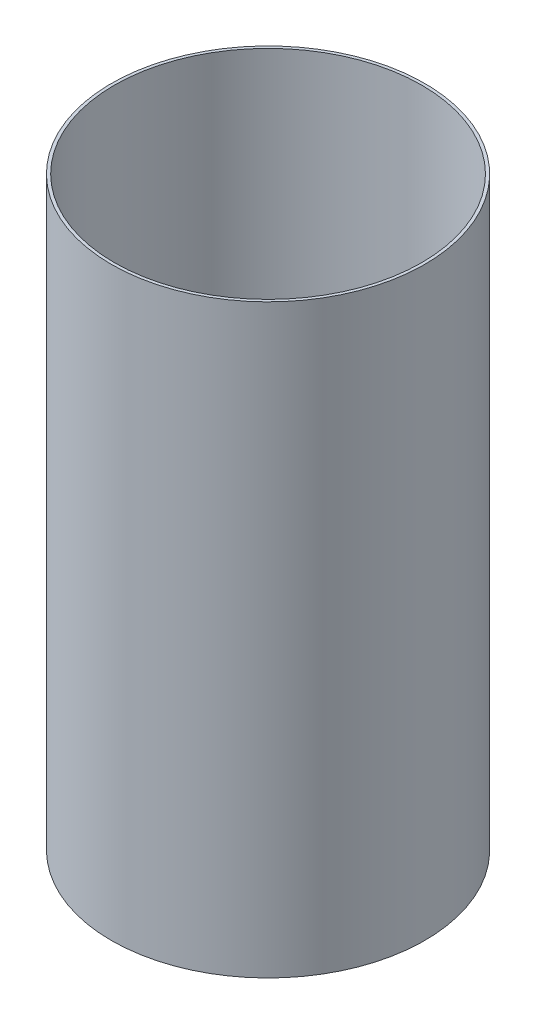
ISO-10303-21;
HEADER;
FILE_DESCRIPTION(('STEP AP214'),'2;1');
FILE_NAME('part.step','',(''),(''),'','','');
FILE_SCHEMA(('AUTOMOTIVE_DESIGN { 1 0 10303 214 1 1 1 1 }'));
ENDSEC;
DATA;
#1=APPLICATION_CONTEXT('core data for automotive mechanical design processes');
#2=APPLICATION_PROTOCOL_DEFINITION('international standard','automotive_design',2000,#1);
#3=PRODUCT_CONTEXT('',#1,'mechanical');
#4=PRODUCT('Part','Part','',(#3));
#5=PRODUCT_RELATED_PRODUCT_CATEGORY('part','',(#4));
#6=PRODUCT_DEFINITION_FORMATION('','',#4);
#7=PRODUCT_DEFINITION_CONTEXT('part definition',#1,'design');
#8=PRODUCT_DEFINITION('design','',#6,#7);
#9=PRODUCT_DEFINITION_SHAPE('','',#8);
#10=(LENGTH_UNIT() NAMED_UNIT(*) SI_UNIT(.MILLI.,.METRE.));
#11=(NAMED_UNIT(*) PLANE_ANGLE_UNIT() SI_UNIT($,.RADIAN.));
#12=(NAMED_UNIT(*) SI_UNIT($,.STERADIAN.) SOLID_ANGLE_UNIT());
#13=UNCERTAINTY_MEASURE_WITH_UNIT(LENGTH_MEASURE(1.E-05),#10,'distance_accuracy_value','');
#14=(GEOMETRIC_REPRESENTATION_CONTEXT(3) GLOBAL_UNCERTAINTY_ASSIGNED_CONTEXT((#13)) GLOBAL_UNIT_ASSIGNED_CONTEXT((#10,
#11,#12)) REPRESENTATION_CONTEXT('',''));
#15=CARTESIAN_POINT('',(0.,0.,0.));
#16=DIRECTION('',(0.,0.,1.));
#17=DIRECTION('',(1.,0.,0.));
#18=AXIS2_PLACEMENT_3D('',#15,#16,#17);
#19=CARTESIAN_POINT('',(0.,139.7,0.));
#20=DIRECTION('',(0.,1.,0.));
#21=DIRECTION('',(0.,0.,1.));
#22=AXIS2_PLACEMENT_3D('',#19,#20,#21);
#23=PLANE('',#22);
#24=CARTESIAN_POINT('',(0.,139.7,0.));
#25=DIRECTION('',(0.,1.,0.));
#26=DIRECTION('',(0.,0.,1.));
#27=AXIS2_PLACEMENT_3D('',#24,#25,#26);
#28=CIRCLE('',#27,74.7776);
#29=CARTESIAN_POINT('',(0.,139.7,74.7776));
#30=VERTEX_POINT('',#29);
#31=EDGE_CURVE('E10',#30,#30,#28,.T.);
#32=ORIENTED_EDGE('',*,*,#31,.T.);
#33=EDGE_LOOP('',(#32));
#34=FACE_BOUND('',#33,.T.);
#35=CARTESIAN_POINT('',(0.,139.7,0.));
#36=DIRECTION('',(0.,1.,0.));
#37=DIRECTION('',(0.,0.,1.));
#38=AXIS2_PLACEMENT_3D('',#35,#36,#37);
#39=CIRCLE('',#38,73.3552);
#40=CARTESIAN_POINT('',(0.,139.7,73.3552));
#41=VERTEX_POINT('',#40);
#42=EDGE_CURVE('E46',#41,#41,#39,.T.);
#43=ORIENTED_EDGE('',*,*,#42,.F.);
#44=EDGE_LOOP('',(#43));
#45=FACE_BOUND('',#44,.T.);
#46=ADVANCED_FACE('F35',(#34,#45),#23,.T.);
#47=CARTESIAN_POINT('',(0.,-139.7,0.));
#48=DIRECTION('',(0.,1.,0.));
#49=DIRECTION('',(0.,0.,1.));
#50=AXIS2_PLACEMENT_3D('',#47,#48,#49);
#51=PLANE('',#50);
#52=CARTESIAN_POINT('',(0.,-139.7,0.));
#53=DIRECTION('',(0.,1.,0.));
#54=DIRECTION('',(0.,0.,1.));
#55=AXIS2_PLACEMENT_3D('',#52,#53,#54);
#56=CIRCLE('',#55,74.7776);
#57=CARTESIAN_POINT('',(0.,-139.7,74.7776));
#58=VERTEX_POINT('',#57);
#59=EDGE_CURVE('E39',#58,#58,#56,.T.);
#60=ORIENTED_EDGE('',*,*,#59,.F.);
#61=EDGE_LOOP('',(#60));
#62=FACE_BOUND('',#61,.T.);
#63=CARTESIAN_POINT('',(0.,-139.7,0.));
#64=DIRECTION('',(0.,1.,0.));
#65=DIRECTION('',(0.,0.,1.));
#66=AXIS2_PLACEMENT_3D('',#63,#64,#65);
#67=CIRCLE('',#66,73.3552);
#68=CARTESIAN_POINT('',(0.,-139.7,73.3552));
#69=VERTEX_POINT('',#68);
#70=EDGE_CURVE('E48',#69,#69,#67,.T.);
#71=ORIENTED_EDGE('',*,*,#70,.T.);
#72=EDGE_LOOP('',(#71));
#73=FACE_BOUND('',#72,.T.);
#74=ADVANCED_FACE('F58',(#62,#73),#51,.F.);
#75=CARTESIAN_POINT('',(0.,139.7,0.));
#76=DIRECTION('',(0.,-1.,0.));
#77=DIRECTION('',(0.,0.,-1.));
#78=AXIS2_PLACEMENT_3D('',#75,#76,#77);
#79=CYLINDRICAL_SURFACE('',#78,74.7776);
#80=ORIENTED_EDGE('',*,*,#31,.F.);
#81=EDGE_LOOP('',(#80));
#82=FACE_BOUND('',#81,.T.);
#83=ORIENTED_EDGE('',*,*,#59,.T.);
#84=EDGE_LOOP('',(#83));
#85=FACE_BOUND('',#84,.T.);
#86=ADVANCED_FACE('F37',(#82,#85),#79,.T.);
#87=CARTESIAN_POINT('',(0.,139.7,0.));
#88=DIRECTION('',(0.,-1.,0.));
#89=DIRECTION('',(0.,0.,-1.));
#90=AXIS2_PLACEMENT_3D('',#87,#88,#89);
#91=CYLINDRICAL_SURFACE('',#90,73.3552);
#92=ORIENTED_EDGE('',*,*,#42,.T.);
#93=EDGE_LOOP('',(#92));
#94=FACE_BOUND('',#93,.T.);
#95=ORIENTED_EDGE('',*,*,#70,.F.);
#96=EDGE_LOOP('',(#95));
#97=FACE_BOUND('',#96,.T.);
#98=ADVANCED_FACE('F54',(#94,#97),#91,.F.);
#99=CLOSED_SHELL('',(#46,#74,#86,#98));
#100=MANIFOLD_SOLID_BREP('B2',#99);
#101=ADVANCED_BREP_SHAPE_REPRESENTATION('',(#18,#100),#14);
#102=SHAPE_DEFINITION_REPRESENTATION(#9,#101);
ENDSEC;
END-ISO-10303-21;
